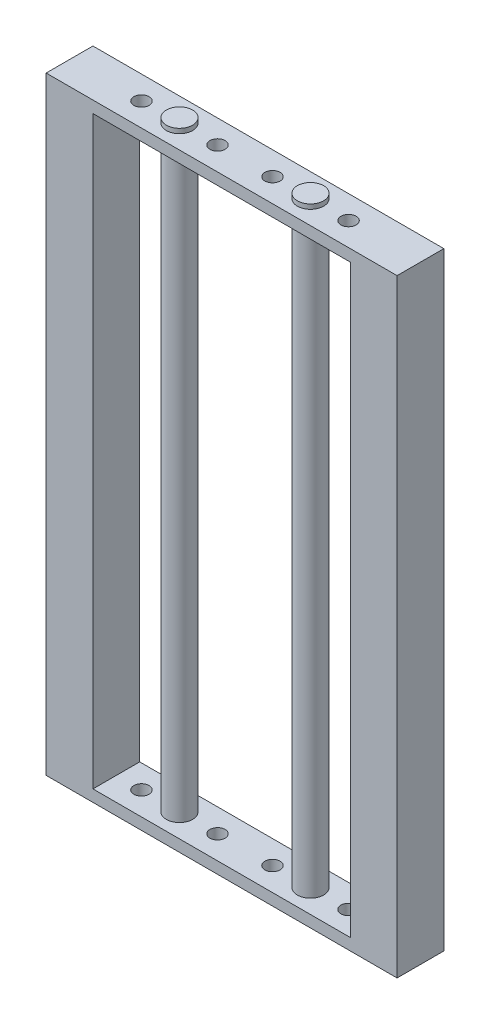
ISO-10303-21;
HEADER;
FILE_DESCRIPTION(('STEP AP214'),'2;1');
FILE_NAME('part.step','',(''),(''),'','','');
FILE_SCHEMA(('AUTOMOTIVE_DESIGN { 1 0 10303 214 1 1 1 1 }'));
ENDSEC;
DATA;
#1=APPLICATION_CONTEXT('core data for automotive mechanical design processes');
#2=APPLICATION_PROTOCOL_DEFINITION('international standard','automotive_design',2000,#1);
#3=PRODUCT_CONTEXT('',#1,'mechanical');
#4=PRODUCT('Part','Part','',(#3));
#5=PRODUCT_RELATED_PRODUCT_CATEGORY('part','',(#4));
#6=PRODUCT_DEFINITION_FORMATION('','',#4);
#7=PRODUCT_DEFINITION_CONTEXT('part definition',#1,'design');
#8=PRODUCT_DEFINITION('design','',#6,#7);
#9=PRODUCT_DEFINITION_SHAPE('','',#8);
#10=(LENGTH_UNIT() NAMED_UNIT(*) SI_UNIT(.MILLI.,.METRE.));
#11=(NAMED_UNIT(*) PLANE_ANGLE_UNIT() SI_UNIT($,.RADIAN.));
#12=(NAMED_UNIT(*) SI_UNIT($,.STERADIAN.) SOLID_ANGLE_UNIT());
#13=UNCERTAINTY_MEASURE_WITH_UNIT(LENGTH_MEASURE(1.E-05),#10,'distance_accuracy_value','');
#14=(GEOMETRIC_REPRESENTATION_CONTEXT(3) GLOBAL_UNCERTAINTY_ASSIGNED_CONTEXT((#13)) GLOBAL_UNIT_ASSIGNED_CONTEXT((#10,
#11,#12)) REPRESENTATION_CONTEXT('',''));
#15=CARTESIAN_POINT('',(0.,0.,0.));
#16=DIRECTION('',(0.,0.,1.));
#17=DIRECTION('',(1.,0.,0.));
#18=AXIS2_PLACEMENT_3D('',#15,#16,#17);
#19=CARTESIAN_POINT('',(0.,0.,20.));
#20=DIRECTION('',(0.,0.,1.));
#21=DIRECTION('',(1.,0.,0.));
#22=AXIS2_PLACEMENT_3D('',#19,#20,#21);
#23=PLANE('',#22);
#24=DIRECTION('',(0.,1.,0.));
#25=VECTOR('',#24,1.);
#26=CARTESIAN_POINT('',(75.,125.,20.));
#27=LINE('',#26,#25);
#28=CARTESIAN_POINT('',(75.,-130.,20.));
#29=VERTEX_POINT('',#28);
#30=CARTESIAN_POINT('',(75.,130.,20.));
#31=VERTEX_POINT('',#30);
#32=EDGE_CURVE('E136',#29,#31,#27,.T.);
#33=ORIENTED_EDGE('',*,*,#32,.T.);
#34=DIRECTION('',(-1.,0.,0.));
#35=VECTOR('',#34,1.);
#36=CARTESIAN_POINT('',(75.,130.,20.));
#37=LINE('',#36,#35);
#38=CARTESIAN_POINT('',(-75.,130.,20.));
#39=VERTEX_POINT('',#38);
#40=EDGE_CURVE('E139',#31,#39,#37,.T.);
#41=ORIENTED_EDGE('',*,*,#40,.T.);
#42=DIRECTION('',(0.,-1.,0.));
#43=VECTOR('',#42,1.);
#44=CARTESIAN_POINT('',(-75.,125.,20.));
#45=LINE('',#44,#43);
#46=CARTESIAN_POINT('',(-75.,-130.,20.));
#47=VERTEX_POINT('',#46);
#48=EDGE_CURVE('E142',#39,#47,#45,.T.);
#49=ORIENTED_EDGE('',*,*,#48,.T.);
#50=DIRECTION('',(1.,0.,0.));
#51=VECTOR('',#50,1.);
#52=CARTESIAN_POINT('',(75.,-130.,20.));
#53=LINE('',#52,#51);
#54=EDGE_CURVE('E144',#47,#29,#53,.T.);
#55=ORIENTED_EDGE('',*,*,#54,.T.);
#56=EDGE_LOOP('',(#33,#41,#49,#55));
#57=FACE_BOUND('',#56,.T.);
#58=DIRECTION('',(0.,1.,0.));
#59=VECTOR('',#58,1.);
#60=CARTESIAN_POINT('',(55.,-105.,20.));
#61=LINE('',#60,#59);
#62=CARTESIAN_POINT('',(55.,-125.,20.));
#63=VERTEX_POINT('',#62);
#64=CARTESIAN_POINT('',(55.,125.,20.));
#65=VERTEX_POINT('',#64);
#66=EDGE_CURVE('E116',#63,#65,#61,.T.);
#67=ORIENTED_EDGE('',*,*,#66,.F.);
#68=DIRECTION('',(1.,0.,0.));
#69=VECTOR('',#68,1.);
#70=CARTESIAN_POINT('',(55.,-125.,20.));
#71=LINE('',#70,#69);
#72=CARTESIAN_POINT('',(-55.,-125.,20.));
#73=VERTEX_POINT('',#72);
#74=EDGE_CURVE('E102',#73,#63,#71,.T.);
#75=ORIENTED_EDGE('',*,*,#74,.F.);
#76=DIRECTION('',(0.,-1.,0.));
#77=VECTOR('',#76,1.);
#78=CARTESIAN_POINT('',(-55.,-105.,20.));
#79=LINE('',#78,#77);
#80=CARTESIAN_POINT('',(-55.,125.,20.));
#81=VERTEX_POINT('',#80);
#82=EDGE_CURVE('E97',#81,#73,#79,.T.);
#83=ORIENTED_EDGE('',*,*,#82,.F.);
#84=DIRECTION('',(-1.,0.,0.));
#85=VECTOR('',#84,1.);
#86=CARTESIAN_POINT('',(55.,125.,20.));
#87=LINE('',#86,#85);
#88=EDGE_CURVE('E118',#65,#81,#87,.T.);
#89=ORIENTED_EDGE('',*,*,#88,.F.);
#90=EDGE_LOOP('',(#67,#75,#83,#89));
#91=FACE_BOUND('',#90,.T.);
#92=ADVANCED_FACE('F33',(#57,#91),#23,.T.);
#93=CARTESIAN_POINT('',(0.,0.,0.));
#94=DIRECTION('',(0.,0.,1.));
#95=DIRECTION('',(1.,0.,0.));
#96=AXIS2_PLACEMENT_3D('',#93,#94,#95);
#97=PLANE('',#96);
#98=DIRECTION('',(-1.,0.,0.));
#99=VECTOR('',#98,1.);
#100=CARTESIAN_POINT('',(-63.356925632263,130.,0.));
#101=LINE('',#100,#99);
#102=CARTESIAN_POINT('',(75.,130.,0.));
#103=VERTEX_POINT('',#102);
#104=CARTESIAN_POINT('',(-75.,130.,0.));
#105=VERTEX_POINT('',#104);
#106=EDGE_CURVE('E112',#103,#105,#101,.T.);
#107=ORIENTED_EDGE('',*,*,#106,.F.);
#108=DIRECTION('',(0.,1.,0.));
#109=VECTOR('',#108,1.);
#110=CARTESIAN_POINT('',(75.,-125.,0.));
#111=LINE('',#110,#109);
#112=CARTESIAN_POINT('',(75.,-130.,0.));
#113=VERTEX_POINT('',#112);
#114=EDGE_CURVE('E140',#113,#103,#111,.T.);
#115=ORIENTED_EDGE('',*,*,#114,.F.);
#116=DIRECTION('',(1.,0.,0.));
#117=VECTOR('',#116,1.);
#118=CARTESIAN_POINT('',(75.,-130.,0.));
#119=LINE('',#118,#117);
#120=CARTESIAN_POINT('',(-75.,-130.,0.));
#121=VERTEX_POINT('',#120);
#122=EDGE_CURVE('E152',#121,#113,#119,.T.);
#123=ORIENTED_EDGE('',*,*,#122,.F.);
#124=DIRECTION('',(0.,-1.,0.));
#125=VECTOR('',#124,1.);
#126=CARTESIAN_POINT('',(-75.,-125.,0.));
#127=LINE('',#126,#125);
#128=EDGE_CURVE('E150',#105,#121,#127,.T.);
#129=ORIENTED_EDGE('',*,*,#128,.F.);
#130=EDGE_LOOP('',(#107,#115,#123,#129));
#131=FACE_BOUND('',#130,.T.);
#132=DIRECTION('',(1.,0.,0.));
#133=VECTOR('',#132,1.);
#134=CARTESIAN_POINT('',(55.,-125.,0.));
#135=LINE('',#134,#133);
#136=CARTESIAN_POINT('',(-55.,-125.,0.));
#137=VERTEX_POINT('',#136);
#138=CARTESIAN_POINT('',(55.,-125.,0.));
#139=VERTEX_POINT('',#138);
#140=EDGE_CURVE('E110',#137,#139,#135,.T.);
#141=ORIENTED_EDGE('',*,*,#140,.T.);
#142=DIRECTION('',(0.,1.,0.));
#143=VECTOR('',#142,1.);
#144=CARTESIAN_POINT('',(55.,105.,0.));
#145=LINE('',#144,#143);
#146=CARTESIAN_POINT('',(55.,125.,0.));
#147=VERTEX_POINT('',#146);
#148=EDGE_CURVE('E124',#139,#147,#145,.T.);
#149=ORIENTED_EDGE('',*,*,#148,.T.);
#150=DIRECTION('',(-1.,0.,0.));
#151=VECTOR('',#150,1.);
#152=CARTESIAN_POINT('',(55.,125.,0.));
#153=LINE('',#152,#151);
#154=CARTESIAN_POINT('',(-55.,125.,0.));
#155=VERTEX_POINT('',#154);
#156=EDGE_CURVE('E128',#147,#155,#153,.T.);
#157=ORIENTED_EDGE('',*,*,#156,.T.);
#158=DIRECTION('',(0.,-1.,0.));
#159=VECTOR('',#158,1.);
#160=CARTESIAN_POINT('',(-55.,-105.,0.));
#161=LINE('',#160,#159);
#162=EDGE_CURVE('E103',#155,#137,#161,.T.);
#163=ORIENTED_EDGE('',*,*,#162,.T.);
#164=EDGE_LOOP('',(#141,#149,#157,#163));
#165=FACE_BOUND('',#164,.T.);
#166=ADVANCED_FACE('F242',(#131,#165),#97,.F.);
#167=CARTESIAN_POINT('',(-63.356925632263,130.,20.));
#168=DIRECTION('',(0.,-1.,0.));
#169=DIRECTION('',(0.,0.,-1.));
#170=AXIS2_PLACEMENT_3D('',#167,#168,#169);
#171=PLANE('',#170);
#172=CARTESIAN_POINT('',(-44.25,130.,10.));
#173=DIRECTION('',(0.,-1.,0.));
#174=DIRECTION('',(0.,0.,-1.));
#175=AXIS2_PLACEMENT_3D('',#172,#173,#174);
#176=CIRCLE('',#175,3.24999999999999);
#177=CARTESIAN_POINT('',(-44.25,130.,6.75000000000002));
#178=VERTEX_POINT('',#177);
#179=EDGE_CURVE('E208',#178,#178,#176,.T.);
#180=ORIENTED_EDGE('',*,*,#179,.T.);
#181=EDGE_LOOP('',(#180));
#182=FACE_BOUND('',#181,.T.);
#183=CARTESIAN_POINT('',(-11.75,130.,10.));
#184=DIRECTION('',(0.,-1.,0.));
#185=DIRECTION('',(0.,0.,-1.));
#186=AXIS2_PLACEMENT_3D('',#183,#184,#185);
#187=CIRCLE('',#186,3.25);
#188=CARTESIAN_POINT('',(-11.75,130.,6.75));
#189=VERTEX_POINT('',#188);
#190=EDGE_CURVE('E205',#189,#189,#187,.T.);
#191=ORIENTED_EDGE('',*,*,#190,.T.);
#192=EDGE_LOOP('',(#191));
#193=FACE_BOUND('',#192,.T.);
#194=CARTESIAN_POINT('',(11.75,130.,10.));
#195=DIRECTION('',(0.,-1.,0.));
#196=DIRECTION('',(0.,0.,-1.));
#197=AXIS2_PLACEMENT_3D('',#194,#195,#196);
#198=CIRCLE('',#197,3.25);
#199=CARTESIAN_POINT('',(11.75,130.,6.75000000000001));
#200=VERTEX_POINT('',#199);
#201=EDGE_CURVE('E201',#200,#200,#198,.T.);
#202=ORIENTED_EDGE('',*,*,#201,.T.);
#203=EDGE_LOOP('',(#202));
#204=FACE_BOUND('',#203,.T.);
#205=CARTESIAN_POINT('',(44.25,130.,10.));
#206=DIRECTION('',(0.,-1.,0.));
#207=DIRECTION('',(0.,0.,-1.));
#208=AXIS2_PLACEMENT_3D('',#205,#206,#207);
#209=CIRCLE('',#208,3.25);
#210=CARTESIAN_POINT('',(44.25,130.,6.75));
#211=VERTEX_POINT('',#210);
#212=EDGE_CURVE('E198',#211,#211,#209,.T.);
#213=ORIENTED_EDGE('',*,*,#212,.T.);
#214=EDGE_LOOP('',(#213));
#215=FACE_BOUND('',#214,.T.);
#216=CARTESIAN_POINT('',(27.9999999999999,130.,10.));
#217=DIRECTION('',(0.,-1.,0.));
#218=DIRECTION('',(0.,0.,-1.));
#219=AXIS2_PLACEMENT_3D('',#216,#217,#218);
#220=CIRCLE('',#219,5.6125119921273);
#221=CARTESIAN_POINT('',(27.9999999999999,130.,4.3874880078727));
#222=VERTEX_POINT('',#221);
#223=EDGE_CURVE('E213',#222,#222,#220,.T.);
#224=ORIENTED_EDGE('',*,*,#223,.T.);
#225=EDGE_LOOP('',(#224));
#226=FACE_BOUND('',#225,.T.);
#227=CARTESIAN_POINT('',(-28.0000000000001,130.,10.));
#228=DIRECTION('',(0.,-1.,0.));
#229=DIRECTION('',(0.,0.,-1.));
#230=AXIS2_PLACEMENT_3D('',#227,#228,#229);
#231=CIRCLE('',#230,5.6125119921273);
#232=CARTESIAN_POINT('',(-28.0000000000001,130.,4.3874880078727));
#233=VERTEX_POINT('',#232);
#234=EDGE_CURVE('E125',#233,#233,#231,.T.);
#235=ORIENTED_EDGE('',*,*,#234,.T.);
#236=EDGE_LOOP('',(#235));
#237=FACE_BOUND('',#236,.T.);
#238=ORIENTED_EDGE('',*,*,#106,.T.);
#239=DIRECTION('',(0.,0.,-1.));
#240=VECTOR('',#239,1.);
#241=CARTESIAN_POINT('',(-75.,130.,20.));
#242=LINE('',#241,#240);
#243=EDGE_CURVE('E162',#39,#105,#242,.T.);
#244=ORIENTED_EDGE('',*,*,#243,.F.);
#245=ORIENTED_EDGE('',*,*,#40,.F.);
#246=DIRECTION('',(0.,0.,-1.));
#247=VECTOR('',#246,1.);
#248=CARTESIAN_POINT('',(75.,130.,20.));
#249=LINE('',#248,#247);
#250=EDGE_CURVE('E165',#31,#103,#249,.T.);
#251=ORIENTED_EDGE('',*,*,#250,.T.);
#252=EDGE_LOOP('',(#238,#244,#245,#251));
#253=FACE_BOUND('',#252,.T.);
#254=ADVANCED_FACE('F35',(#182,#193,#204,#215,#226,#237,#253),#171,.F.);
#255=CARTESIAN_POINT('',(-75.,-125.,20.));
#256=DIRECTION('',(1.,0.,0.));
#257=DIRECTION('',(0.,0.,-1.));
#258=AXIS2_PLACEMENT_3D('',#255,#256,#257);
#259=PLANE('',#258);
#260=ORIENTED_EDGE('',*,*,#128,.T.);
#261=DIRECTION('',(0.,0.,-1.));
#262=VECTOR('',#261,1.);
#263=CARTESIAN_POINT('',(-75.,-130.,20.));
#264=LINE('',#263,#262);
#265=EDGE_CURVE('E159',#47,#121,#264,.T.);
#266=ORIENTED_EDGE('',*,*,#265,.F.);
#267=ORIENTED_EDGE('',*,*,#48,.F.);
#268=ORIENTED_EDGE('',*,*,#243,.T.);
#269=EDGE_LOOP('',(#260,#266,#267,#268));
#270=FACE_BOUND('',#269,.T.);
#271=ADVANCED_FACE('F259',(#270),#259,.F.);
#272=CARTESIAN_POINT('',(75.,-130.,20.));
#273=DIRECTION('',(0.,1.,0.));
#274=DIRECTION('',(-1.,0.,0.));
#275=AXIS2_PLACEMENT_3D('',#272,#273,#274);
#276=PLANE('',#275);
#277=CARTESIAN_POINT('',(-44.25,-130.,10.));
#278=DIRECTION('',(0.,-1.,0.));
#279=DIRECTION('',(1.,0.,0.));
#280=AXIS2_PLACEMENT_3D('',#277,#278,#279);
#281=CIRCLE('',#280,3.25);
#282=CARTESIAN_POINT('',(-41.,-130.,10.));
#283=VERTEX_POINT('',#282);
#284=EDGE_CURVE('E178',#283,#283,#281,.T.);
#285=ORIENTED_EDGE('',*,*,#284,.F.);
#286=EDGE_LOOP('',(#285));
#287=FACE_BOUND('',#286,.T.);
#288=CARTESIAN_POINT('',(-11.75,-130.,10.));
#289=DIRECTION('',(0.,-1.,0.));
#290=DIRECTION('',(1.,0.,0.));
#291=AXIS2_PLACEMENT_3D('',#288,#289,#290);
#292=CIRCLE('',#291,3.25);
#293=CARTESIAN_POINT('',(-8.50000000000004,-130.,10.));
#294=VERTEX_POINT('',#293);
#295=EDGE_CURVE('E435',#294,#294,#292,.T.);
#296=ORIENTED_EDGE('',*,*,#295,.F.);
#297=EDGE_LOOP('',(#296));
#298=FACE_BOUND('',#297,.T.);
#299=CARTESIAN_POINT('',(11.75,-130.,10.));
#300=DIRECTION('',(0.,-1.,0.));
#301=DIRECTION('',(1.,0.,0.));
#302=AXIS2_PLACEMENT_3D('',#299,#300,#301);
#303=CIRCLE('',#302,3.25);
#304=CARTESIAN_POINT('',(15.,-130.,10.));
#305=VERTEX_POINT('',#304);
#306=EDGE_CURVE('E438',#305,#305,#303,.T.);
#307=ORIENTED_EDGE('',*,*,#306,.F.);
#308=EDGE_LOOP('',(#307));
#309=FACE_BOUND('',#308,.T.);
#310=CARTESIAN_POINT('',(44.25,-130.,10.));
#311=DIRECTION('',(0.,-1.,0.));
#312=DIRECTION('',(1.,0.,0.));
#313=AXIS2_PLACEMENT_3D('',#310,#311,#312);
#314=CIRCLE('',#313,3.25);
#315=CARTESIAN_POINT('',(47.5,-130.,10.));
#316=VERTEX_POINT('',#315);
#317=EDGE_CURVE('E443',#316,#316,#314,.T.);
#318=ORIENTED_EDGE('',*,*,#317,.F.);
#319=EDGE_LOOP('',(#318));
#320=FACE_BOUND('',#319,.T.);
#321=ORIENTED_EDGE('',*,*,#122,.T.);
#322=DIRECTION('',(0.,0.,-1.));
#323=VECTOR('',#322,1.);
#324=CARTESIAN_POINT('',(75.,-130.,20.));
#325=LINE('',#324,#323);
#326=EDGE_CURVE('E147',#29,#113,#325,.T.);
#327=ORIENTED_EDGE('',*,*,#326,.F.);
#328=ORIENTED_EDGE('',*,*,#54,.F.);
#329=ORIENTED_EDGE('',*,*,#265,.T.);
#330=EDGE_LOOP('',(#321,#327,#328,#329));
#331=FACE_BOUND('',#330,.T.);
#332=ADVANCED_FACE('F256',(#287,#298,#309,#320,#331),#276,.F.);
#333=CARTESIAN_POINT('',(75.,-125.,20.));
#334=DIRECTION('',(-1.,0.,0.));
#335=DIRECTION('',(0.,0.,1.));
#336=AXIS2_PLACEMENT_3D('',#333,#334,#335);
#337=PLANE('',#336);
#338=ORIENTED_EDGE('',*,*,#114,.T.);
#339=ORIENTED_EDGE('',*,*,#250,.F.);
#340=ORIENTED_EDGE('',*,*,#32,.F.);
#341=ORIENTED_EDGE('',*,*,#326,.T.);
#342=EDGE_LOOP('',(#338,#339,#340,#341));
#343=FACE_BOUND('',#342,.T.);
#344=ADVANCED_FACE('F253',(#343),#337,.F.);
#345=CARTESIAN_POINT('',(55.,-125.,20.));
#346=DIRECTION('',(0.,1.,0.));
#347=DIRECTION('',(0.,0.,1.));
#348=AXIS2_PLACEMENT_3D('',#345,#346,#347);
#349=PLANE('',#348);
#350=CARTESIAN_POINT('',(-44.25,-125.,10.));
#351=DIRECTION('',(0.,1.,0.));
#352=DIRECTION('',(0.,0.,1.));
#353=AXIS2_PLACEMENT_3D('',#350,#351,#352);
#354=CIRCLE('',#353,3.25);
#355=CARTESIAN_POINT('',(-44.25,-125.,13.25));
#356=VERTEX_POINT('',#355);
#357=EDGE_CURVE('E37',#356,#356,#354,.T.);
#358=ORIENTED_EDGE('',*,*,#357,.F.);
#359=EDGE_LOOP('',(#358));
#360=FACE_BOUND('',#359,.T.);
#361=CARTESIAN_POINT('',(-11.75,-125.,10.));
#362=DIRECTION('',(0.,1.,0.));
#363=DIRECTION('',(0.,0.,1.));
#364=AXIS2_PLACEMENT_3D('',#361,#362,#363);
#365=CIRCLE('',#364,3.25);
#366=CARTESIAN_POINT('',(-11.75,-125.,13.25));
#367=VERTEX_POINT('',#366);
#368=EDGE_CURVE('E180',#367,#367,#365,.T.);
#369=ORIENTED_EDGE('',*,*,#368,.F.);
#370=EDGE_LOOP('',(#369));
#371=FACE_BOUND('',#370,.T.);
#372=CARTESIAN_POINT('',(11.75,-125.,10.));
#373=DIRECTION('',(0.,1.,0.));
#374=DIRECTION('',(0.,0.,1.));
#375=AXIS2_PLACEMENT_3D('',#372,#373,#374);
#376=CIRCLE('',#375,3.25);
#377=CARTESIAN_POINT('',(11.75,-125.,13.25));
#378=VERTEX_POINT('',#377);
#379=EDGE_CURVE('E177',#378,#378,#376,.T.);
#380=ORIENTED_EDGE('',*,*,#379,.F.);
#381=EDGE_LOOP('',(#380));
#382=FACE_BOUND('',#381,.T.);
#383=CARTESIAN_POINT('',(44.25,-125.,10.));
#384=DIRECTION('',(0.,1.,0.));
#385=DIRECTION('',(0.,0.,1.));
#386=AXIS2_PLACEMENT_3D('',#383,#384,#385);
#387=CIRCLE('',#386,3.25);
#388=CARTESIAN_POINT('',(44.25,-125.,13.25));
#389=VERTEX_POINT('',#388);
#390=EDGE_CURVE('E174',#389,#389,#387,.T.);
#391=ORIENTED_EDGE('',*,*,#390,.F.);
#392=EDGE_LOOP('',(#391));
#393=FACE_BOUND('',#392,.T.);
#394=CARTESIAN_POINT('',(28.,-125.,10.));
#395=DIRECTION('',(0.,1.,0.));
#396=DIRECTION('',(0.,0.,1.));
#397=AXIS2_PLACEMENT_3D('',#394,#395,#396);
#398=CIRCLE('',#397,5.6125119921273);
#399=CARTESIAN_POINT('',(28.,-125.,15.6125119921273));
#400=VERTEX_POINT('',#399);
#401=EDGE_CURVE('E11',#400,#400,#398,.T.);
#402=ORIENTED_EDGE('',*,*,#401,.F.);
#403=EDGE_LOOP('',(#402));
#404=FACE_BOUND('',#403,.T.);
#405=CARTESIAN_POINT('',(-28.,-125.,10.));
#406=DIRECTION('',(0.,1.,0.));
#407=DIRECTION('',(0.,0.,1.));
#408=AXIS2_PLACEMENT_3D('',#405,#406,#407);
#409=CIRCLE('',#408,5.6125119921273);
#410=CARTESIAN_POINT('',(-28.,-125.,15.6125119921273));
#411=VERTEX_POINT('',#410);
#412=EDGE_CURVE('E171',#411,#411,#409,.T.);
#413=ORIENTED_EDGE('',*,*,#412,.F.);
#414=EDGE_LOOP('',(#413));
#415=FACE_BOUND('',#414,.T.);
#416=ORIENTED_EDGE('',*,*,#140,.F.);
#417=DIRECTION('',(0.,0.,-1.));
#418=VECTOR('',#417,1.);
#419=CARTESIAN_POINT('',(-55.,-125.,20.));
#420=LINE('',#419,#418);
#421=EDGE_CURVE('E55',#73,#137,#420,.T.);
#422=ORIENTED_EDGE('',*,*,#421,.F.);
#423=ORIENTED_EDGE('',*,*,#74,.T.);
#424=DIRECTION('',(0.,0.,-1.));
#425=VECTOR('',#424,1.);
#426=CARTESIAN_POINT('',(55.,-125.,20.));
#427=LINE('',#426,#425);
#428=EDGE_CURVE('E113',#63,#139,#427,.T.);
#429=ORIENTED_EDGE('',*,*,#428,.T.);
#430=EDGE_LOOP('',(#416,#422,#423,#429));
#431=FACE_BOUND('',#430,.T.);
#432=ADVANCED_FACE('F106',(#360,#371,#382,#393,#404,#415,#431),#349,.T.);
#433=CARTESIAN_POINT('',(55.,105.,20.));
#434=DIRECTION('',(-1.,0.,0.));
#435=DIRECTION('',(0.,0.,1.));
#436=AXIS2_PLACEMENT_3D('',#433,#434,#435);
#437=PLANE('',#436);
#438=ORIENTED_EDGE('',*,*,#148,.F.);
#439=ORIENTED_EDGE('',*,*,#428,.F.);
#440=ORIENTED_EDGE('',*,*,#66,.T.);
#441=DIRECTION('',(0.,0.,-1.));
#442=VECTOR('',#441,1.);
#443=CARTESIAN_POINT('',(55.,125.,20.));
#444=LINE('',#443,#442);
#445=EDGE_CURVE('E133',#65,#147,#444,.T.);
#446=ORIENTED_EDGE('',*,*,#445,.T.);
#447=EDGE_LOOP('',(#438,#439,#440,#446));
#448=FACE_BOUND('',#447,.T.);
#449=ADVANCED_FACE('F283',(#448),#437,.T.);
#450=CARTESIAN_POINT('',(55.,125.,20.));
#451=DIRECTION('',(0.,-1.,0.));
#452=DIRECTION('',(0.,0.,-1.));
#453=AXIS2_PLACEMENT_3D('',#450,#451,#452);
#454=PLANE('',#453);
#455=CARTESIAN_POINT('',(-44.25,125.,10.));
#456=DIRECTION('',(0.,-1.,0.));
#457=DIRECTION('',(0.,0.,-1.));
#458=AXIS2_PLACEMENT_3D('',#455,#456,#457);
#459=CIRCLE('',#458,3.24999999999999);
#460=CARTESIAN_POINT('',(-44.25,125.,6.75000000000002));
#461=VERTEX_POINT('',#460);
#462=EDGE_CURVE('E202',#461,#461,#459,.T.);
#463=ORIENTED_EDGE('',*,*,#462,.F.);
#464=EDGE_LOOP('',(#463));
#465=FACE_BOUND('',#464,.T.);
#466=CARTESIAN_POINT('',(-11.75,125.,10.));
#467=DIRECTION('',(0.,-1.,0.));
#468=DIRECTION('',(0.,0.,-1.));
#469=AXIS2_PLACEMENT_3D('',#466,#467,#468);
#470=CIRCLE('',#469,3.25);
#471=CARTESIAN_POINT('',(-11.75,125.,6.75));
#472=VERTEX_POINT('',#471);
#473=EDGE_CURVE('E194',#472,#472,#470,.T.);
#474=ORIENTED_EDGE('',*,*,#473,.F.);
#475=EDGE_LOOP('',(#474));
#476=FACE_BOUND('',#475,.T.);
#477=CARTESIAN_POINT('',(11.75,125.,10.));
#478=DIRECTION('',(0.,-1.,0.));
#479=DIRECTION('',(0.,0.,-1.));
#480=AXIS2_PLACEMENT_3D('',#477,#478,#479);
#481=CIRCLE('',#480,3.25);
#482=CARTESIAN_POINT('',(11.75,125.,6.75000000000001));
#483=VERTEX_POINT('',#482);
#484=EDGE_CURVE('E189',#483,#483,#481,.T.);
#485=ORIENTED_EDGE('',*,*,#484,.F.);
#486=EDGE_LOOP('',(#485));
#487=FACE_BOUND('',#486,.T.);
#488=CARTESIAN_POINT('',(44.25,125.,10.));
#489=DIRECTION('',(0.,-1.,0.));
#490=DIRECTION('',(0.,0.,-1.));
#491=AXIS2_PLACEMENT_3D('',#488,#489,#490);
#492=CIRCLE('',#491,3.25);
#493=CARTESIAN_POINT('',(44.25,125.,6.75));
#494=VERTEX_POINT('',#493);
#495=EDGE_CURVE('E185',#494,#494,#492,.T.);
#496=ORIENTED_EDGE('',*,*,#495,.F.);
#497=EDGE_LOOP('',(#496));
#498=FACE_BOUND('',#497,.T.);
#499=CARTESIAN_POINT('',(27.9999999999999,125.,10.));
#500=DIRECTION('',(0.,-1.,0.));
#501=DIRECTION('',(0.,0.,-1.));
#502=AXIS2_PLACEMENT_3D('',#499,#500,#501);
#503=CIRCLE('',#502,5.6125119921273);
#504=CARTESIAN_POINT('',(27.9999999999999,125.,4.3874880078727));
#505=VERTEX_POINT('',#504);
#506=EDGE_CURVE('E42',#505,#505,#503,.T.);
#507=ORIENTED_EDGE('',*,*,#506,.F.);
#508=EDGE_LOOP('',(#507));
#509=FACE_BOUND('',#508,.T.);
#510=CARTESIAN_POINT('',(-28.0000000000001,125.,10.));
#511=DIRECTION('',(0.,-1.,0.));
#512=DIRECTION('',(0.,0.,-1.));
#513=AXIS2_PLACEMENT_3D('',#510,#511,#512);
#514=CIRCLE('',#513,5.6125119921273);
#515=CARTESIAN_POINT('',(-28.0000000000001,125.,4.3874880078727));
#516=VERTEX_POINT('',#515);
#517=EDGE_CURVE('E168',#516,#516,#514,.T.);
#518=ORIENTED_EDGE('',*,*,#517,.F.);
#519=EDGE_LOOP('',(#518));
#520=FACE_BOUND('',#519,.T.);
#521=ORIENTED_EDGE('',*,*,#156,.F.);
#522=ORIENTED_EDGE('',*,*,#445,.F.);
#523=ORIENTED_EDGE('',*,*,#88,.T.);
#524=DIRECTION('',(0.,0.,-1.));
#525=VECTOR('',#524,1.);
#526=CARTESIAN_POINT('',(-55.,125.,20.));
#527=LINE('',#526,#525);
#528=EDGE_CURVE('E50',#81,#155,#527,.T.);
#529=ORIENTED_EDGE('',*,*,#528,.T.);
#530=EDGE_LOOP('',(#521,#522,#523,#529));
#531=FACE_BOUND('',#530,.T.);
#532=ADVANCED_FACE('F280',(#465,#476,#487,#498,#509,#520,#531),#454,.T.);
#533=CARTESIAN_POINT('',(-55.,-105.,20.));
#534=DIRECTION('',(1.,0.,0.));
#535=DIRECTION('',(0.,0.,-1.));
#536=AXIS2_PLACEMENT_3D('',#533,#534,#535);
#537=PLANE('',#536);
#538=ORIENTED_EDGE('',*,*,#162,.F.);
#539=ORIENTED_EDGE('',*,*,#528,.F.);
#540=ORIENTED_EDGE('',*,*,#82,.T.);
#541=ORIENTED_EDGE('',*,*,#421,.T.);
#542=EDGE_LOOP('',(#538,#539,#540,#541));
#543=FACE_BOUND('',#542,.T.);
#544=ADVANCED_FACE('F98',(#543),#537,.T.);
#545=CARTESIAN_POINT('',(-28.0000000000001,132.,10.));
#546=DIRECTION('',(0.,-1.,0.));
#547=DIRECTION('',(1.,0.,0.));
#548=AXIS2_PLACEMENT_3D('',#545,#546,#547);
#549=CYLINDRICAL_SURFACE('',#548,5.6125119921273);
#550=ORIENTED_EDGE('',*,*,#412,.T.);
#551=EDGE_LOOP('',(#550));
#552=FACE_BOUND('',#551,.T.);
#553=ORIENTED_EDGE('',*,*,#517,.T.);
#554=EDGE_LOOP('',(#553));
#555=FACE_BOUND('',#554,.T.);
#556=ADVANCED_FACE('F229',(#552,#555),#549,.T.);
#557=CARTESIAN_POINT('',(-28.0000000000001,132.,10.));
#558=DIRECTION('',(0.,-1.,0.));
#559=DIRECTION('',(1.,0.,0.));
#560=AXIS2_PLACEMENT_3D('',#557,#558,#559);
#561=CIRCLE('',#560,5.6125119921273);
#562=CARTESIAN_POINT('',(-22.3874880078728,132.,10.));
#563=VERTEX_POINT('',#562);
#564=EDGE_CURVE('E217',#563,#563,#561,.T.);
#565=ORIENTED_EDGE('',*,*,#564,.T.);
#566=EDGE_LOOP('',(#565));
#567=FACE_BOUND('',#566,.T.);
#568=ORIENTED_EDGE('',*,*,#234,.F.);
#569=EDGE_LOOP('',(#568));
#570=FACE_BOUND('',#569,.T.);
#571=ADVANCED_FACE('F226',(#567,#570),#549,.T.);
#572=CARTESIAN_POINT('',(-28.0000000000001,132.,10.));
#573=DIRECTION('',(0.,-1.,0.));
#574=DIRECTION('',(1.,0.,0.));
#575=AXIS2_PLACEMENT_3D('',#572,#573,#574);
#576=PLANE('',#575);
#577=ORIENTED_EDGE('',*,*,#564,.F.);
#578=EDGE_LOOP('',(#577));
#579=FACE_BOUND('',#578,.T.);
#580=ADVANCED_FACE('F228',(#579),#576,.F.);
#581=CARTESIAN_POINT('',(27.9999999999999,132.,10.));
#582=DIRECTION('',(0.,-1.,0.));
#583=DIRECTION('',(1.,0.,0.));
#584=AXIS2_PLACEMENT_3D('',#581,#582,#583);
#585=CYLINDRICAL_SURFACE('',#584,5.6125119921273);
#586=ORIENTED_EDGE('',*,*,#401,.T.);
#587=EDGE_LOOP('',(#586));
#588=FACE_BOUND('',#587,.T.);
#589=ORIENTED_EDGE('',*,*,#506,.T.);
#590=EDGE_LOOP('',(#589));
#591=FACE_BOUND('',#590,.T.);
#592=ADVANCED_FACE('F236',(#588,#591),#585,.T.);
#593=CARTESIAN_POINT('',(27.9999999999999,132.,10.));
#594=DIRECTION('',(0.,-1.,0.));
#595=DIRECTION('',(-1.,0.,0.));
#596=AXIS2_PLACEMENT_3D('',#593,#594,#595);
#597=CIRCLE('',#596,5.6125119921273);
#598=CARTESIAN_POINT('',(22.3874880078726,132.,10.));
#599=VERTEX_POINT('',#598);
#600=EDGE_CURVE('E211',#599,#599,#597,.T.);
#601=ORIENTED_EDGE('',*,*,#600,.T.);
#602=EDGE_LOOP('',(#601));
#603=FACE_BOUND('',#602,.T.);
#604=ORIENTED_EDGE('',*,*,#223,.F.);
#605=EDGE_LOOP('',(#604));
#606=FACE_BOUND('',#605,.T.);
#607=ADVANCED_FACE('F322',(#603,#606),#585,.T.);
#608=CARTESIAN_POINT('',(27.9999999999999,132.,10.));
#609=DIRECTION('',(0.,1.,0.));
#610=DIRECTION('',(-1.,0.,0.));
#611=AXIS2_PLACEMENT_3D('',#608,#609,#610);
#612=PLANE('',#611);
#613=ORIENTED_EDGE('',*,*,#600,.F.);
#614=EDGE_LOOP('',(#613));
#615=FACE_BOUND('',#614,.T.);
#616=ADVANCED_FACE('F332',(#615),#612,.T.);
#617=CARTESIAN_POINT('',(44.25,135.,10.));
#618=DIRECTION('',(0.,-1.,0.));
#619=DIRECTION('',(0.,0.,-1.));
#620=AXIS2_PLACEMENT_3D('',#617,#618,#619);
#621=CYLINDRICAL_SURFACE('',#620,3.25);
#622=ORIENTED_EDGE('',*,*,#495,.T.);
#623=EDGE_LOOP('',(#622));
#624=FACE_BOUND('',#623,.T.);
#625=ORIENTED_EDGE('',*,*,#212,.F.);
#626=EDGE_LOOP('',(#625));
#627=FACE_BOUND('',#626,.T.);
#628=ADVANCED_FACE('F340',(#624,#627),#621,.F.);
#629=CARTESIAN_POINT('',(11.75,135.,10.));
#630=DIRECTION('',(0.,-1.,0.));
#631=DIRECTION('',(0.,0.,-1.));
#632=AXIS2_PLACEMENT_3D('',#629,#630,#631);
#633=CYLINDRICAL_SURFACE('',#632,3.25);
#634=ORIENTED_EDGE('',*,*,#484,.T.);
#635=EDGE_LOOP('',(#634));
#636=FACE_BOUND('',#635,.T.);
#637=ORIENTED_EDGE('',*,*,#201,.F.);
#638=EDGE_LOOP('',(#637));
#639=FACE_BOUND('',#638,.T.);
#640=ADVANCED_FACE('F355',(#636,#639),#633,.F.);
#641=CARTESIAN_POINT('',(-11.75,135.,10.));
#642=DIRECTION('',(0.,-1.,0.));
#643=DIRECTION('',(0.,0.,-1.));
#644=AXIS2_PLACEMENT_3D('',#641,#642,#643);
#645=CYLINDRICAL_SURFACE('',#644,3.25);
#646=ORIENTED_EDGE('',*,*,#473,.T.);
#647=EDGE_LOOP('',(#646));
#648=FACE_BOUND('',#647,.T.);
#649=ORIENTED_EDGE('',*,*,#190,.F.);
#650=EDGE_LOOP('',(#649));
#651=FACE_BOUND('',#650,.T.);
#652=ADVANCED_FACE('F364',(#648,#651),#645,.F.);
#653=CARTESIAN_POINT('',(-44.25,135.,10.));
#654=DIRECTION('',(0.,-1.,0.));
#655=DIRECTION('',(0.,0.,-1.));
#656=AXIS2_PLACEMENT_3D('',#653,#654,#655);
#657=CYLINDRICAL_SURFACE('',#656,3.24999999999999);
#658=ORIENTED_EDGE('',*,*,#462,.T.);
#659=EDGE_LOOP('',(#658));
#660=FACE_BOUND('',#659,.T.);
#661=ORIENTED_EDGE('',*,*,#179,.F.);
#662=EDGE_LOOP('',(#661));
#663=FACE_BOUND('',#662,.T.);
#664=ADVANCED_FACE('F374',(#660,#663),#657,.F.);
#665=CARTESIAN_POINT('',(44.25,-120.,10.));
#666=DIRECTION('',(0.,-1.,0.));
#667=DIRECTION('',(1.,0.,0.));
#668=AXIS2_PLACEMENT_3D('',#665,#666,#667);
#669=CYLINDRICAL_SURFACE('',#668,3.25);
#670=ORIENTED_EDGE('',*,*,#390,.T.);
#671=EDGE_LOOP('',(#670));
#672=FACE_BOUND('',#671,.T.);
#673=ORIENTED_EDGE('',*,*,#317,.T.);
#674=EDGE_LOOP('',(#673));
#675=FACE_BOUND('',#674,.T.);
#676=ADVANCED_FACE('F383',(#672,#675),#669,.F.);
#677=CARTESIAN_POINT('',(11.75,-120.,10.));
#678=DIRECTION('',(0.,-1.,0.));
#679=DIRECTION('',(1.,0.,0.));
#680=AXIS2_PLACEMENT_3D('',#677,#678,#679);
#681=CYLINDRICAL_SURFACE('',#680,3.25);
#682=ORIENTED_EDGE('',*,*,#379,.T.);
#683=EDGE_LOOP('',(#682));
#684=FACE_BOUND('',#683,.T.);
#685=ORIENTED_EDGE('',*,*,#306,.T.);
#686=EDGE_LOOP('',(#685));
#687=FACE_BOUND('',#686,.T.);
#688=ADVANCED_FACE('F400',(#684,#687),#681,.F.);
#689=CARTESIAN_POINT('',(-11.75,-120.,10.));
#690=DIRECTION('',(0.,-1.,0.));
#691=DIRECTION('',(1.,0.,0.));
#692=AXIS2_PLACEMENT_3D('',#689,#690,#691);
#693=CYLINDRICAL_SURFACE('',#692,3.25);
#694=ORIENTED_EDGE('',*,*,#368,.T.);
#695=EDGE_LOOP('',(#694));
#696=FACE_BOUND('',#695,.T.);
#697=ORIENTED_EDGE('',*,*,#295,.T.);
#698=EDGE_LOOP('',(#697));
#699=FACE_BOUND('',#698,.T.);
#700=ADVANCED_FACE('F410',(#696,#699),#693,.F.);
#701=CARTESIAN_POINT('',(-44.25,-120.,10.));
#702=DIRECTION('',(0.,-1.,0.));
#703=DIRECTION('',(1.,0.,0.));
#704=AXIS2_PLACEMENT_3D('',#701,#702,#703);
#705=CYLINDRICAL_SURFACE('',#704,3.25);
#706=ORIENTED_EDGE('',*,*,#357,.T.);
#707=EDGE_LOOP('',(#706));
#708=FACE_BOUND('',#707,.T.);
#709=ORIENTED_EDGE('',*,*,#284,.T.);
#710=EDGE_LOOP('',(#709));
#711=FACE_BOUND('',#710,.T.);
#712=ADVANCED_FACE('F420',(#708,#711),#705,.F.);
#713=CLOSED_SHELL('',(#92,#166,#254,#271,#332,#344,#432,#449,#532,#544,#556,#571,#580,#592,#607,
#616,#628,#640,#652,#664,#676,#688,#700,#712));
#714=MANIFOLD_SOLID_BREP('B2',#713);
#715=ADVANCED_BREP_SHAPE_REPRESENTATION('',(#18,#714),#14);
#716=SHAPE_DEFINITION_REPRESENTATION(#9,#715);
ENDSEC;
END-ISO-10303-21;
